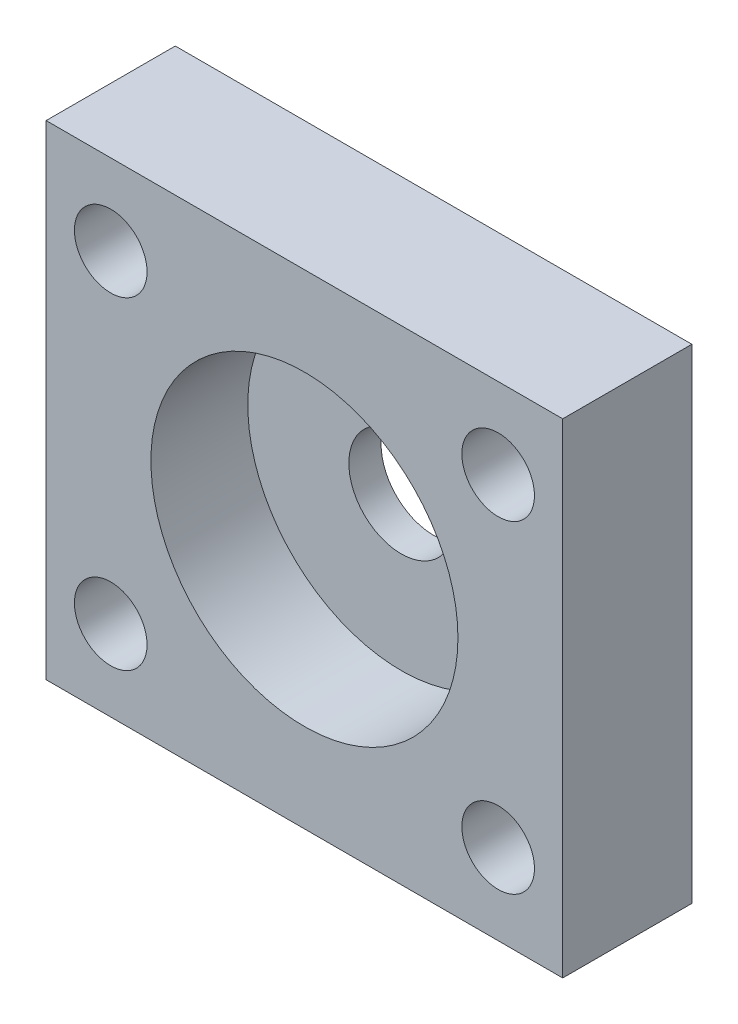
ISO-10303-21;
HEADER;
FILE_DESCRIPTION(('STEP AP214'),'2;1');
FILE_NAME('part.step','',(''),(''),'','','');
FILE_SCHEMA(('AUTOMOTIVE_DESIGN { 1 0 10303 214 1 1 1 1 }'));
ENDSEC;
DATA;
#1=APPLICATION_CONTEXT('core data for automotive mechanical design processes');
#2=APPLICATION_PROTOCOL_DEFINITION('international standard','automotive_design',2000,#1);
#3=PRODUCT_CONTEXT('',#1,'mechanical');
#4=PRODUCT('Part','Part','',(#3));
#5=PRODUCT_RELATED_PRODUCT_CATEGORY('part','',(#4));
#6=PRODUCT_DEFINITION_FORMATION('','',#4);
#7=PRODUCT_DEFINITION_CONTEXT('part definition',#1,'design');
#8=PRODUCT_DEFINITION('design','',#6,#7);
#9=PRODUCT_DEFINITION_SHAPE('','',#8);
#10=(LENGTH_UNIT() NAMED_UNIT(*) SI_UNIT(.MILLI.,.METRE.));
#11=(NAMED_UNIT(*) PLANE_ANGLE_UNIT() SI_UNIT($,.RADIAN.));
#12=(NAMED_UNIT(*) SI_UNIT($,.STERADIAN.) SOLID_ANGLE_UNIT());
#13=UNCERTAINTY_MEASURE_WITH_UNIT(LENGTH_MEASURE(1.E-05),#10,'distance_accuracy_value','');
#14=(GEOMETRIC_REPRESENTATION_CONTEXT(3) GLOBAL_UNCERTAINTY_ASSIGNED_CONTEXT((#13)) GLOBAL_UNIT_ASSIGNED_CONTEXT((#10,
#11,#12)) REPRESENTATION_CONTEXT('',''));
#15=CARTESIAN_POINT('',(0.,0.,0.));
#16=DIRECTION('',(0.,0.,1.));
#17=DIRECTION('',(1.,0.,0.));
#18=AXIS2_PLACEMENT_3D('',#15,#16,#17);
#19=CARTESIAN_POINT('',(0.,0.,2.));
#20=DIRECTION('',(0.,0.,1.));
#21=DIRECTION('',(1.,0.,0.));
#22=AXIS2_PLACEMENT_3D('',#19,#20,#21);
#23=PLANE('',#22);
#24=CARTESIAN_POINT('',(0.,0.,2.));
#25=DIRECTION('',(0.,0.,1.));
#26=DIRECTION('',(1.,0.,0.));
#27=AXIS2_PLACEMENT_3D('',#24,#25,#26);
#28=CIRCLE('',#27,3.25);
#29=CARTESIAN_POINT('',(3.25,0.,2.));
#30=VERTEX_POINT('',#29);
#31=EDGE_CURVE('E10',#30,#30,#28,.T.);
#32=ORIENTED_EDGE('',*,*,#31,.F.);
#33=EDGE_LOOP('',(#32));
#34=FACE_BOUND('',#33,.T.);
#35=CARTESIAN_POINT('',(0.,0.,2.));
#36=DIRECTION('',(0.,0.,1.));
#37=DIRECTION('',(1.,0.,0.));
#38=AXIS2_PLACEMENT_3D('',#35,#36,#37);
#39=CIRCLE('',#38,9.51);
#40=CARTESIAN_POINT('',(9.51,0.,2.));
#41=VERTEX_POINT('',#40);
#42=EDGE_CURVE('E26',#41,#41,#39,.T.);
#43=ORIENTED_EDGE('',*,*,#42,.T.);
#44=EDGE_LOOP('',(#43));
#45=FACE_BOUND('',#44,.T.);
#46=ADVANCED_FACE('F16',(#34,#45),#23,.T.);
#47=CARTESIAN_POINT('',(0.,0.,-1.));
#48=DIRECTION('',(0.,0.,1.));
#49=DIRECTION('',(1.,0.,0.));
#50=AXIS2_PLACEMENT_3D('',#47,#48,#49);
#51=CYLINDRICAL_SURFACE('',#50,3.25);
#52=ORIENTED_EDGE('',*,*,#31,.T.);
#53=EDGE_LOOP('',(#52));
#54=FACE_BOUND('',#53,.T.);
#55=CARTESIAN_POINT('',(0.,0.,0.));
#56=DIRECTION('',(0.,0.,1.));
#57=DIRECTION('',(1.,0.,0.));
#58=AXIS2_PLACEMENT_3D('',#55,#56,#57);
#59=CIRCLE('',#58,3.25);
#60=CARTESIAN_POINT('',(3.25,0.,0.));
#61=VERTEX_POINT('',#60);
#62=EDGE_CURVE('E131',#61,#61,#59,.T.);
#63=ORIENTED_EDGE('',*,*,#62,.F.);
#64=EDGE_LOOP('',(#63));
#65=FACE_BOUND('',#64,.T.);
#66=ADVANCED_FACE('F18',(#54,#65),#51,.F.);
#67=CARTESIAN_POINT('',(12.,10.,-1.));
#68=DIRECTION('',(0.,0.,1.));
#69=DIRECTION('',(1.,0.,0.));
#70=AXIS2_PLACEMENT_3D('',#67,#68,#69);
#71=CYLINDRICAL_SURFACE('',#70,2.25);
#72=CARTESIAN_POINT('',(12.,10.,8.));
#73=DIRECTION('',(0.,0.,1.));
#74=DIRECTION('',(1.,0.,0.));
#75=AXIS2_PLACEMENT_3D('',#72,#73,#74);
#76=CIRCLE('',#75,2.25);
#77=CARTESIAN_POINT('',(14.25,10.,8.));
#78=VERTEX_POINT('',#77);
#79=EDGE_CURVE('E105',#78,#78,#76,.T.);
#80=ORIENTED_EDGE('',*,*,#79,.T.);
#81=EDGE_LOOP('',(#80));
#82=FACE_BOUND('',#81,.T.);
#83=CARTESIAN_POINT('',(12.,10.,0.));
#84=DIRECTION('',(0.,0.,1.));
#85=DIRECTION('',(1.,0.,0.));
#86=AXIS2_PLACEMENT_3D('',#83,#84,#85);
#87=CIRCLE('',#86,2.25);
#88=CARTESIAN_POINT('',(14.25,10.,0.));
#89=VERTEX_POINT('',#88);
#90=EDGE_CURVE('E154',#89,#89,#87,.T.);
#91=ORIENTED_EDGE('',*,*,#90,.F.);
#92=EDGE_LOOP('',(#91));
#93=FACE_BOUND('',#92,.T.);
#94=ADVANCED_FACE('F177',(#82,#93),#71,.F.);
#95=CARTESIAN_POINT('',(-12.,10.,-1.));
#96=DIRECTION('',(0.,0.,1.));
#97=DIRECTION('',(1.,0.,0.));
#98=AXIS2_PLACEMENT_3D('',#95,#96,#97);
#99=CYLINDRICAL_SURFACE('',#98,2.25);
#100=CARTESIAN_POINT('',(-12.,10.,8.));
#101=DIRECTION('',(0.,0.,1.));
#102=DIRECTION('',(1.,0.,0.));
#103=AXIS2_PLACEMENT_3D('',#100,#101,#102);
#104=CIRCLE('',#103,2.25);
#105=CARTESIAN_POINT('',(-9.75,10.,8.));
#106=VERTEX_POINT('',#105);
#107=EDGE_CURVE('E107',#106,#106,#104,.T.);
#108=ORIENTED_EDGE('',*,*,#107,.T.);
#109=EDGE_LOOP('',(#108));
#110=FACE_BOUND('',#109,.T.);
#111=CARTESIAN_POINT('',(-12.,10.,0.));
#112=DIRECTION('',(0.,0.,1.));
#113=DIRECTION('',(1.,0.,0.));
#114=AXIS2_PLACEMENT_3D('',#111,#112,#113);
#115=CIRCLE('',#114,2.25);
#116=CARTESIAN_POINT('',(-9.75,10.,0.));
#117=VERTEX_POINT('',#116);
#118=EDGE_CURVE('E150',#117,#117,#115,.T.);
#119=ORIENTED_EDGE('',*,*,#118,.F.);
#120=EDGE_LOOP('',(#119));
#121=FACE_BOUND('',#120,.T.);
#122=ADVANCED_FACE('F166',(#110,#121),#99,.F.);
#123=CARTESIAN_POINT('',(0.,0.,2.));
#124=DIRECTION('',(0.,0.,1.));
#125=DIRECTION('',(1.,0.,0.));
#126=AXIS2_PLACEMENT_3D('',#123,#124,#125);
#127=CYLINDRICAL_SURFACE('',#126,9.51);
#128=CARTESIAN_POINT('',(0.,0.,8.));
#129=DIRECTION('',(0.,0.,1.));
#130=DIRECTION('',(1.,0.,0.));
#131=AXIS2_PLACEMENT_3D('',#128,#129,#130);
#132=CIRCLE('',#131,9.51);
#133=CARTESIAN_POINT('',(9.51,0.,8.));
#134=VERTEX_POINT('',#133);
#135=EDGE_CURVE('E120',#134,#134,#132,.T.);
#136=ORIENTED_EDGE('',*,*,#135,.T.);
#137=EDGE_LOOP('',(#136));
#138=FACE_BOUND('',#137,.T.);
#139=ORIENTED_EDGE('',*,*,#42,.F.);
#140=EDGE_LOOP('',(#139));
#141=FACE_BOUND('',#140,.T.);
#142=ADVANCED_FACE('F163',(#138,#141),#127,.F.);
#143=CARTESIAN_POINT('',(12.,-10.,-1.));
#144=DIRECTION('',(0.,0.,1.));
#145=DIRECTION('',(1.,0.,0.));
#146=AXIS2_PLACEMENT_3D('',#143,#144,#145);
#147=CYLINDRICAL_SURFACE('',#146,2.25);
#148=CARTESIAN_POINT('',(12.,-10.,8.));
#149=DIRECTION('',(0.,0.,1.));
#150=DIRECTION('',(1.,0.,0.));
#151=AXIS2_PLACEMENT_3D('',#148,#149,#150);
#152=CIRCLE('',#151,2.25);
#153=CARTESIAN_POINT('',(14.25,-10.,8.));
#154=VERTEX_POINT('',#153);
#155=EDGE_CURVE('E116',#154,#154,#152,.T.);
#156=ORIENTED_EDGE('',*,*,#155,.T.);
#157=EDGE_LOOP('',(#156));
#158=FACE_BOUND('',#157,.T.);
#159=CARTESIAN_POINT('',(12.,-10.,0.));
#160=DIRECTION('',(0.,0.,1.));
#161=DIRECTION('',(1.,0.,0.));
#162=AXIS2_PLACEMENT_3D('',#159,#160,#161);
#163=CIRCLE('',#162,2.25);
#164=CARTESIAN_POINT('',(14.25,-10.,0.));
#165=VERTEX_POINT('',#164);
#166=EDGE_CURVE('E127',#165,#165,#163,.T.);
#167=ORIENTED_EDGE('',*,*,#166,.F.);
#168=EDGE_LOOP('',(#167));
#169=FACE_BOUND('',#168,.T.);
#170=ADVANCED_FACE('F165',(#158,#169),#147,.F.);
#171=CARTESIAN_POINT('',(-12.,-10.,-1.));
#172=DIRECTION('',(0.,0.,1.));
#173=DIRECTION('',(1.,0.,0.));
#174=AXIS2_PLACEMENT_3D('',#171,#172,#173);
#175=CYLINDRICAL_SURFACE('',#174,2.25);
#176=CARTESIAN_POINT('',(-12.,-10.,8.));
#177=DIRECTION('',(0.,0.,1.));
#178=DIRECTION('',(1.,0.,0.));
#179=AXIS2_PLACEMENT_3D('',#176,#177,#178);
#180=CIRCLE('',#179,2.25);
#181=CARTESIAN_POINT('',(-9.75,-10.,8.));
#182=VERTEX_POINT('',#181);
#183=EDGE_CURVE('E121',#182,#182,#180,.T.);
#184=ORIENTED_EDGE('',*,*,#183,.T.);
#185=EDGE_LOOP('',(#184));
#186=FACE_BOUND('',#185,.T.);
#187=CARTESIAN_POINT('',(-12.,-10.,0.));
#188=DIRECTION('',(0.,0.,1.));
#189=DIRECTION('',(1.,0.,0.));
#190=AXIS2_PLACEMENT_3D('',#187,#188,#189);
#191=CIRCLE('',#190,2.25);
#192=CARTESIAN_POINT('',(-9.75,-10.,0.));
#193=VERTEX_POINT('',#192);
#194=EDGE_CURVE('E132',#193,#193,#191,.T.);
#195=ORIENTED_EDGE('',*,*,#194,.F.);
#196=EDGE_LOOP('',(#195));
#197=FACE_BOUND('',#196,.T.);
#198=ADVANCED_FACE('F174',(#186,#197),#175,.F.);
#199=CARTESIAN_POINT('',(16.,-15.,0.));
#200=DIRECTION('',(1.,0.,0.));
#201=DIRECTION('',(0.,1.,0.));
#202=AXIS2_PLACEMENT_3D('',#199,#200,#201);
#203=PLANE('',#202);
#204=DIRECTION('',(0.,0.,1.));
#205=VECTOR('',#204,1.);
#206=CARTESIAN_POINT('',(16.,-15.,0.));
#207=LINE('',#206,#205);
#208=CARTESIAN_POINT('',(16.,-15.,0.));
#209=VERTEX_POINT('',#208);
#210=CARTESIAN_POINT('',(16.,-15.,8.));
#211=VERTEX_POINT('',#210);
#212=EDGE_CURVE('E73',#209,#211,#207,.T.);
#213=ORIENTED_EDGE('',*,*,#212,.F.);
#214=DIRECTION('',(0.,1.,0.));
#215=VECTOR('',#214,1.);
#216=CARTESIAN_POINT('',(16.,-15.,0.));
#217=LINE('',#216,#215);
#218=CARTESIAN_POINT('',(16.,15.,0.));
#219=VERTEX_POINT('',#218);
#220=EDGE_CURVE('E37',#209,#219,#217,.T.);
#221=ORIENTED_EDGE('',*,*,#220,.T.);
#222=DIRECTION('',(0.,0.,1.));
#223=VECTOR('',#222,1.);
#224=CARTESIAN_POINT('',(16.,15.,0.));
#225=LINE('',#224,#223);
#226=CARTESIAN_POINT('',(16.,15.,8.));
#227=VERTEX_POINT('',#226);
#228=EDGE_CURVE('E111',#219,#227,#225,.T.);
#229=ORIENTED_EDGE('',*,*,#228,.T.);
#230=DIRECTION('',(0.,1.,0.));
#231=VECTOR('',#230,1.);
#232=CARTESIAN_POINT('',(16.,-15.,8.));
#233=LINE('',#232,#231);
#234=EDGE_CURVE('E124',#211,#227,#233,.T.);
#235=ORIENTED_EDGE('',*,*,#234,.F.);
#236=EDGE_LOOP('',(#213,#221,#229,#235));
#237=FACE_BOUND('',#236,.T.);
#238=ADVANCED_FACE('F194',(#237),#203,.T.);
#239=CARTESIAN_POINT('',(-16.,-15.,0.));
#240=DIRECTION('',(0.,0.,1.));
#241=DIRECTION('',(1.,0.,0.));
#242=AXIS2_PLACEMENT_3D('',#239,#240,#241);
#243=PLANE('',#242);
#244=ORIENTED_EDGE('',*,*,#90,.T.);
#245=EDGE_LOOP('',(#244));
#246=FACE_BOUND('',#245,.T.);
#247=ORIENTED_EDGE('',*,*,#118,.T.);
#248=EDGE_LOOP('',(#247));
#249=FACE_BOUND('',#248,.T.);
#250=ORIENTED_EDGE('',*,*,#62,.T.);
#251=EDGE_LOOP('',(#250));
#252=FACE_BOUND('',#251,.T.);
#253=ORIENTED_EDGE('',*,*,#166,.T.);
#254=EDGE_LOOP('',(#253));
#255=FACE_BOUND('',#254,.T.);
#256=ORIENTED_EDGE('',*,*,#194,.T.);
#257=EDGE_LOOP('',(#256));
#258=FACE_BOUND('',#257,.T.);
#259=DIRECTION('',(1.,0.,0.));
#260=VECTOR('',#259,1.);
#261=CARTESIAN_POINT('',(-16.,15.,0.));
#262=LINE('',#261,#260);
#263=CARTESIAN_POINT('',(-16.,15.,0.));
#264=VERTEX_POINT('',#263);
#265=EDGE_CURVE('E103',#264,#219,#262,.T.);
#266=ORIENTED_EDGE('',*,*,#265,.T.);
#267=ORIENTED_EDGE('',*,*,#220,.F.);
#268=DIRECTION('',(1.,0.,0.));
#269=VECTOR('',#268,1.);
#270=CARTESIAN_POINT('',(-16.,-15.,0.));
#271=LINE('',#270,#269);
#272=CARTESIAN_POINT('',(-16.,-15.,0.));
#273=VERTEX_POINT('',#272);
#274=EDGE_CURVE('E78',#273,#209,#271,.T.);
#275=ORIENTED_EDGE('',*,*,#274,.F.);
#276=DIRECTION('',(0.,1.,0.));
#277=VECTOR('',#276,1.);
#278=CARTESIAN_POINT('',(-16.,-15.,0.));
#279=LINE('',#278,#277);
#280=EDGE_CURVE('E86',#273,#264,#279,.T.);
#281=ORIENTED_EDGE('',*,*,#280,.T.);
#282=EDGE_LOOP('',(#266,#267,#275,#281));
#283=FACE_BOUND('',#282,.T.);
#284=ADVANCED_FACE('F190',(#246,#249,#252,#255,#258,#283),#243,.F.);
#285=CARTESIAN_POINT('',(-16.,15.,0.));
#286=DIRECTION('',(0.,1.,0.));
#287=DIRECTION('',(1.,0.,0.));
#288=AXIS2_PLACEMENT_3D('',#285,#286,#287);
#289=PLANE('',#288);
#290=ORIENTED_EDGE('',*,*,#265,.F.);
#291=DIRECTION('',(0.,0.,1.));
#292=VECTOR('',#291,1.);
#293=CARTESIAN_POINT('',(-16.,15.,0.));
#294=LINE('',#293,#292);
#295=CARTESIAN_POINT('',(-16.,15.,8.));
#296=VERTEX_POINT('',#295);
#297=EDGE_CURVE('E94',#264,#296,#294,.T.);
#298=ORIENTED_EDGE('',*,*,#297,.T.);
#299=DIRECTION('',(1.,0.,0.));
#300=VECTOR('',#299,1.);
#301=CARTESIAN_POINT('',(-16.,15.,8.));
#302=LINE('',#301,#300);
#303=EDGE_CURVE('E91',#296,#227,#302,.T.);
#304=ORIENTED_EDGE('',*,*,#303,.T.);
#305=ORIENTED_EDGE('',*,*,#228,.F.);
#306=EDGE_LOOP('',(#290,#298,#304,#305));
#307=FACE_BOUND('',#306,.T.);
#308=ADVANCED_FACE('F193',(#307),#289,.T.);
#309=CARTESIAN_POINT('',(-16.,-15.,8.));
#310=DIRECTION('',(0.,0.,1.));
#311=DIRECTION('',(1.,0.,0.));
#312=AXIS2_PLACEMENT_3D('',#309,#310,#311);
#313=PLANE('',#312);
#314=ORIENTED_EDGE('',*,*,#79,.F.);
#315=EDGE_LOOP('',(#314));
#316=FACE_BOUND('',#315,.T.);
#317=ORIENTED_EDGE('',*,*,#107,.F.);
#318=EDGE_LOOP('',(#317));
#319=FACE_BOUND('',#318,.T.);
#320=ORIENTED_EDGE('',*,*,#135,.F.);
#321=EDGE_LOOP('',(#320));
#322=FACE_BOUND('',#321,.T.);
#323=ORIENTED_EDGE('',*,*,#155,.F.);
#324=EDGE_LOOP('',(#323));
#325=FACE_BOUND('',#324,.T.);
#326=ORIENTED_EDGE('',*,*,#183,.F.);
#327=EDGE_LOOP('',(#326));
#328=FACE_BOUND('',#327,.T.);
#329=DIRECTION('',(0.,1.,0.));
#330=VECTOR('',#329,1.);
#331=CARTESIAN_POINT('',(-16.,-15.,8.));
#332=LINE('',#331,#330);
#333=CARTESIAN_POINT('',(-16.,-15.,8.));
#334=VERTEX_POINT('',#333);
#335=EDGE_CURVE('E84',#334,#296,#332,.T.);
#336=ORIENTED_EDGE('',*,*,#335,.F.);
#337=DIRECTION('',(1.,0.,0.));
#338=VECTOR('',#337,1.);
#339=CARTESIAN_POINT('',(-16.,-15.,8.));
#340=LINE('',#339,#338);
#341=EDGE_CURVE('E67',#334,#211,#340,.T.);
#342=ORIENTED_EDGE('',*,*,#341,.T.);
#343=ORIENTED_EDGE('',*,*,#234,.T.);
#344=ORIENTED_EDGE('',*,*,#303,.F.);
#345=EDGE_LOOP('',(#336,#342,#343,#344));
#346=FACE_BOUND('',#345,.T.);
#347=ADVANCED_FACE('F89',(#316,#319,#322,#325,#328,#346),#313,.T.);
#348=CARTESIAN_POINT('',(-16.,-15.,0.));
#349=DIRECTION('',(0.,1.,0.));
#350=DIRECTION('',(1.,0.,0.));
#351=AXIS2_PLACEMENT_3D('',#348,#349,#350);
#352=PLANE('',#351);
#353=ORIENTED_EDGE('',*,*,#212,.T.);
#354=ORIENTED_EDGE('',*,*,#341,.F.);
#355=DIRECTION('',(0.,0.,1.));
#356=VECTOR('',#355,1.);
#357=CARTESIAN_POINT('',(-16.,-15.,0.));
#358=LINE('',#357,#356);
#359=EDGE_CURVE('E71',#273,#334,#358,.T.);
#360=ORIENTED_EDGE('',*,*,#359,.F.);
#361=ORIENTED_EDGE('',*,*,#274,.T.);
#362=EDGE_LOOP('',(#353,#354,#360,#361));
#363=FACE_BOUND('',#362,.T.);
#364=ADVANCED_FACE('F69',(#363),#352,.F.);
#365=CARTESIAN_POINT('',(-16.,-15.,0.));
#366=DIRECTION('',(1.,0.,0.));
#367=DIRECTION('',(0.,1.,0.));
#368=AXIS2_PLACEMENT_3D('',#365,#366,#367);
#369=PLANE('',#368);
#370=ORIENTED_EDGE('',*,*,#335,.T.);
#371=ORIENTED_EDGE('',*,*,#297,.F.);
#372=ORIENTED_EDGE('',*,*,#280,.F.);
#373=ORIENTED_EDGE('',*,*,#359,.T.);
#374=EDGE_LOOP('',(#370,#371,#372,#373));
#375=FACE_BOUND('',#374,.T.);
#376=ADVANCED_FACE('F82',(#375),#369,.F.);
#377=CLOSED_SHELL('',(#46,#66,#94,#122,#142,#170,#198,#238,#284,#308,#347,#364,#376));
#378=MANIFOLD_SOLID_BREP('B1',#377);
#379=ADVANCED_BREP_SHAPE_REPRESENTATION('',(#18,#378),#14);
#380=SHAPE_DEFINITION_REPRESENTATION(#9,#379);
ENDSEC;
END-ISO-10303-21;
